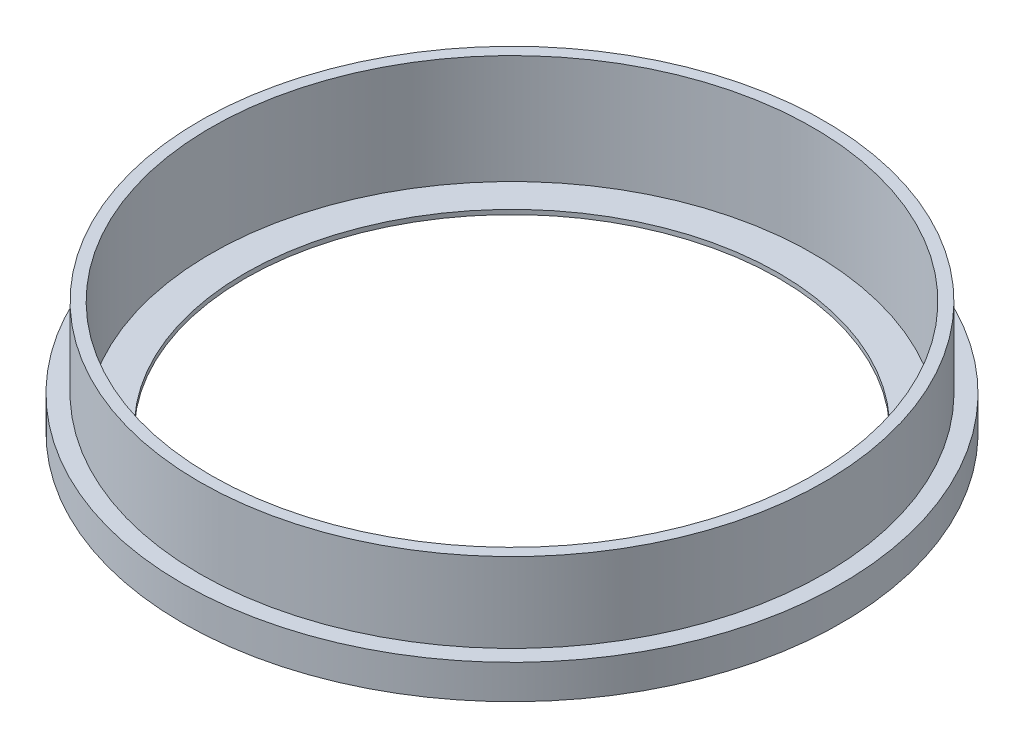
ISO-10303-21;
HEADER;
FILE_DESCRIPTION(('STEP AP214'),'2;1');
FILE_NAME('part.step','',(''),(''),'','','');
FILE_SCHEMA(('AUTOMOTIVE_DESIGN { 1 0 10303 214 1 1 1 1 }'));
ENDSEC;
DATA;
#1=APPLICATION_CONTEXT('core data for automotive mechanical design processes');
#2=APPLICATION_PROTOCOL_DEFINITION('international standard','automotive_design',2000,#1);
#3=PRODUCT_CONTEXT('',#1,'mechanical');
#4=PRODUCT('Part','Part','',(#3));
#5=PRODUCT_RELATED_PRODUCT_CATEGORY('part','',(#4));
#6=PRODUCT_DEFINITION_FORMATION('','',#4);
#7=PRODUCT_DEFINITION_CONTEXT('part definition',#1,'design');
#8=PRODUCT_DEFINITION('design','',#6,#7);
#9=PRODUCT_DEFINITION_SHAPE('','',#8);
#10=(LENGTH_UNIT() NAMED_UNIT(*) SI_UNIT(.MILLI.,.METRE.));
#11=(NAMED_UNIT(*) PLANE_ANGLE_UNIT() SI_UNIT($,.RADIAN.));
#12=(NAMED_UNIT(*) SI_UNIT($,.STERADIAN.) SOLID_ANGLE_UNIT());
#13=UNCERTAINTY_MEASURE_WITH_UNIT(LENGTH_MEASURE(1.E-05),#10,'distance_accuracy_value','');
#14=(GEOMETRIC_REPRESENTATION_CONTEXT(3) GLOBAL_UNCERTAINTY_ASSIGNED_CONTEXT((#13)) GLOBAL_UNIT_ASSIGNED_CONTEXT((#10,
#11,#12)) REPRESENTATION_CONTEXT('',''));
#15=CARTESIAN_POINT('',(0.,0.,0.));
#16=DIRECTION('',(0.,0.,1.));
#17=DIRECTION('',(1.,0.,0.));
#18=AXIS2_PLACEMENT_3D('',#15,#16,#17);
#19=CARTESIAN_POINT('',(0.,10.,0.));
#20=DIRECTION('',(0.,-1.,0.));
#21=DIRECTION('',(0.,0.,-1.));
#22=AXIS2_PLACEMENT_3D('',#19,#20,#21);
#23=CYLINDRICAL_SURFACE('',#22,27.5);
#24=CARTESIAN_POINT('',(0.,3.,0.));
#25=DIRECTION('',(0.,1.,0.));
#26=DIRECTION('',(0.,0.,1.));
#27=AXIS2_PLACEMENT_3D('',#24,#25,#26);
#28=CIRCLE('',#27,27.5);
#29=CARTESIAN_POINT('',(0.,3.,27.5));
#30=VERTEX_POINT('',#29);
#31=EDGE_CURVE('E48',#30,#30,#28,.T.);
#32=ORIENTED_EDGE('',*,*,#31,.T.);
#33=EDGE_LOOP('',(#32));
#34=FACE_BOUND('',#33,.T.);
#35=CARTESIAN_POINT('',(0.,10.,0.));
#36=DIRECTION('',(0.,1.,0.));
#37=DIRECTION('',(0.,0.,1.));
#38=AXIS2_PLACEMENT_3D('',#35,#36,#37);
#39=CIRCLE('',#38,27.5);
#40=CARTESIAN_POINT('',(0.,10.,27.5));
#41=VERTEX_POINT('',#40);
#42=EDGE_CURVE('E11',#41,#41,#39,.T.);
#43=ORIENTED_EDGE('',*,*,#42,.F.);
#44=EDGE_LOOP('',(#43));
#45=FACE_BOUND('',#44,.T.);
#46=ADVANCED_FACE('F45',(#34,#45),#23,.T.);
#47=CARTESIAN_POINT('',(0.,10.,0.));
#48=DIRECTION('',(0.,1.,0.));
#49=DIRECTION('',(0.,0.,1.));
#50=AXIS2_PLACEMENT_3D('',#47,#48,#49);
#51=PLANE('',#50);
#52=CARTESIAN_POINT('',(0.,10.,0.));
#53=DIRECTION('',(0.,1.,0.));
#54=DIRECTION('',(0.,0.,1.));
#55=AXIS2_PLACEMENT_3D('',#52,#53,#54);
#56=CIRCLE('',#55,26.5);
#57=CARTESIAN_POINT('',(0.,10.,26.5));
#58=VERTEX_POINT('',#57);
#59=EDGE_CURVE('E63',#58,#58,#56,.T.);
#60=ORIENTED_EDGE('',*,*,#59,.F.);
#61=EDGE_LOOP('',(#60));
#62=FACE_BOUND('',#61,.T.);
#63=ORIENTED_EDGE('',*,*,#42,.T.);
#64=EDGE_LOOP('',(#63));
#65=FACE_BOUND('',#64,.T.);
#66=ADVANCED_FACE('F96',(#62,#65),#51,.T.);
#67=CARTESIAN_POINT('',(0.,3.,0.));
#68=DIRECTION('',(0.,1.,0.));
#69=DIRECTION('',(0.,0.,1.));
#70=AXIS2_PLACEMENT_3D('',#67,#68,#69);
#71=PLANE('',#70);
#72=ORIENTED_EDGE('',*,*,#31,.F.);
#73=EDGE_LOOP('',(#72));
#74=FACE_BOUND('',#73,.T.);
#75=CARTESIAN_POINT('',(0.,3.,0.));
#76=DIRECTION('',(0.,1.,0.));
#77=DIRECTION('',(0.,0.,1.));
#78=AXIS2_PLACEMENT_3D('',#75,#76,#77);
#79=CIRCLE('',#78,29.);
#80=CARTESIAN_POINT('',(0.,3.,29.));
#81=VERTEX_POINT('',#80);
#82=EDGE_CURVE('E55',#81,#81,#79,.T.);
#83=ORIENTED_EDGE('',*,*,#82,.T.);
#84=EDGE_LOOP('',(#83));
#85=FACE_BOUND('',#84,.T.);
#86=ADVANCED_FACE('F98',(#74,#85),#71,.T.);
#87=CARTESIAN_POINT('',(0.,3.,0.));
#88=DIRECTION('',(0.,-1.,0.));
#89=DIRECTION('',(0.,0.,-1.));
#90=AXIS2_PLACEMENT_3D('',#87,#88,#89);
#91=CYLINDRICAL_SURFACE('',#90,29.);
#92=ORIENTED_EDGE('',*,*,#82,.F.);
#93=EDGE_LOOP('',(#92));
#94=FACE_BOUND('',#93,.T.);
#95=CARTESIAN_POINT('',(0.,0.,0.));
#96=DIRECTION('',(0.,1.,0.));
#97=DIRECTION('',(0.,0.,1.));
#98=AXIS2_PLACEMENT_3D('',#95,#96,#97);
#99=CIRCLE('',#98,29.);
#100=CARTESIAN_POINT('',(0.,0.,29.));
#101=VERTEX_POINT('',#100);
#102=EDGE_CURVE('E57',#101,#101,#99,.T.);
#103=ORIENTED_EDGE('',*,*,#102,.T.);
#104=EDGE_LOOP('',(#103));
#105=FACE_BOUND('',#104,.T.);
#106=ADVANCED_FACE('F104',(#94,#105),#91,.T.);
#107=CARTESIAN_POINT('',(0.,0.,0.));
#108=DIRECTION('',(0.,1.,0.));
#109=DIRECTION('',(0.,0.,1.));
#110=AXIS2_PLACEMENT_3D('',#107,#108,#109);
#111=PLANE('',#110);
#112=CARTESIAN_POINT('',(0.,0.,0.));
#113=DIRECTION('',(0.,1.,0.));
#114=DIRECTION('',(0.,0.,1.));
#115=AXIS2_PLACEMENT_3D('',#112,#113,#114);
#116=CIRCLE('',#115,23.5);
#117=CARTESIAN_POINT('',(0.,0.,23.5));
#118=VERTEX_POINT('',#117);
#119=EDGE_CURVE('E66',#118,#118,#116,.T.);
#120=ORIENTED_EDGE('',*,*,#119,.T.);
#121=EDGE_LOOP('',(#120));
#122=FACE_BOUND('',#121,.T.);
#123=ORIENTED_EDGE('',*,*,#102,.F.);
#124=EDGE_LOOP('',(#123));
#125=FACE_BOUND('',#124,.T.);
#126=ADVANCED_FACE('F75',(#122,#125),#111,.F.);
#127=CARTESIAN_POINT('',(0.,0.400000000000001,0.));
#128=DIRECTION('',(0.,1.,0.));
#129=DIRECTION('',(0.,0.,1.));
#130=AXIS2_PLACEMENT_3D('',#127,#128,#129);
#131=CYLINDRICAL_SURFACE('',#130,26.5);
#132=CARTESIAN_POINT('',(0.,0.400000000000001,0.));
#133=DIRECTION('',(0.,1.,0.));
#134=DIRECTION('',(0.,0.,1.));
#135=AXIS2_PLACEMENT_3D('',#132,#133,#134);
#136=CIRCLE('',#135,26.5);
#137=CARTESIAN_POINT('',(0.,0.400000000000001,26.5));
#138=VERTEX_POINT('',#137);
#139=EDGE_CURVE('E60',#138,#138,#136,.T.);
#140=ORIENTED_EDGE('',*,*,#139,.F.);
#141=EDGE_LOOP('',(#140));
#142=FACE_BOUND('',#141,.T.);
#143=ORIENTED_EDGE('',*,*,#59,.T.);
#144=EDGE_LOOP('',(#143));
#145=FACE_BOUND('',#144,.T.);
#146=ADVANCED_FACE('F87',(#142,#145),#131,.F.);
#147=CARTESIAN_POINT('',(0.,0.400000000000001,0.));
#148=DIRECTION('',(0.,1.,0.));
#149=DIRECTION('',(0.,0.,1.));
#150=AXIS2_PLACEMENT_3D('',#147,#148,#149);
#151=PLANE('',#150);
#152=CARTESIAN_POINT('',(0.,0.400000000000001,0.));
#153=DIRECTION('',(0.,1.,0.));
#154=DIRECTION('',(0.,0.,1.));
#155=AXIS2_PLACEMENT_3D('',#152,#153,#154);
#156=CIRCLE('',#155,23.5);
#157=CARTESIAN_POINT('',(0.,0.400000000000001,23.5));
#158=VERTEX_POINT('',#157);
#159=EDGE_CURVE('E69',#158,#158,#156,.T.);
#160=ORIENTED_EDGE('',*,*,#159,.F.);
#161=EDGE_LOOP('',(#160));
#162=FACE_BOUND('',#161,.T.);
#163=ORIENTED_EDGE('',*,*,#139,.T.);
#164=EDGE_LOOP('',(#163));
#165=FACE_BOUND('',#164,.T.);
#166=ADVANCED_FACE('F81',(#162,#165),#151,.T.);
#167=CARTESIAN_POINT('',(0.,0.,0.));
#168=DIRECTION('',(0.,1.,0.));
#169=DIRECTION('',(0.,0.,1.));
#170=AXIS2_PLACEMENT_3D('',#167,#168,#169);
#171=CYLINDRICAL_SURFACE('',#170,23.5);
#172=ORIENTED_EDGE('',*,*,#119,.F.);
#173=EDGE_LOOP('',(#172));
#174=FACE_BOUND('',#173,.T.);
#175=ORIENTED_EDGE('',*,*,#159,.T.);
#176=EDGE_LOOP('',(#175));
#177=FACE_BOUND('',#176,.T.);
#178=ADVANCED_FACE('F78',(#174,#177),#171,.F.);
#179=CLOSED_SHELL('',(#46,#66,#86,#106,#126,#146,#166,#178));
#180=MANIFOLD_SOLID_BREP('B2',#179);
#181=ADVANCED_BREP_SHAPE_REPRESENTATION('',(#18,#180),#14);
#182=SHAPE_DEFINITION_REPRESENTATION(#9,#181);
ENDSEC;
END-ISO-10303-21;
